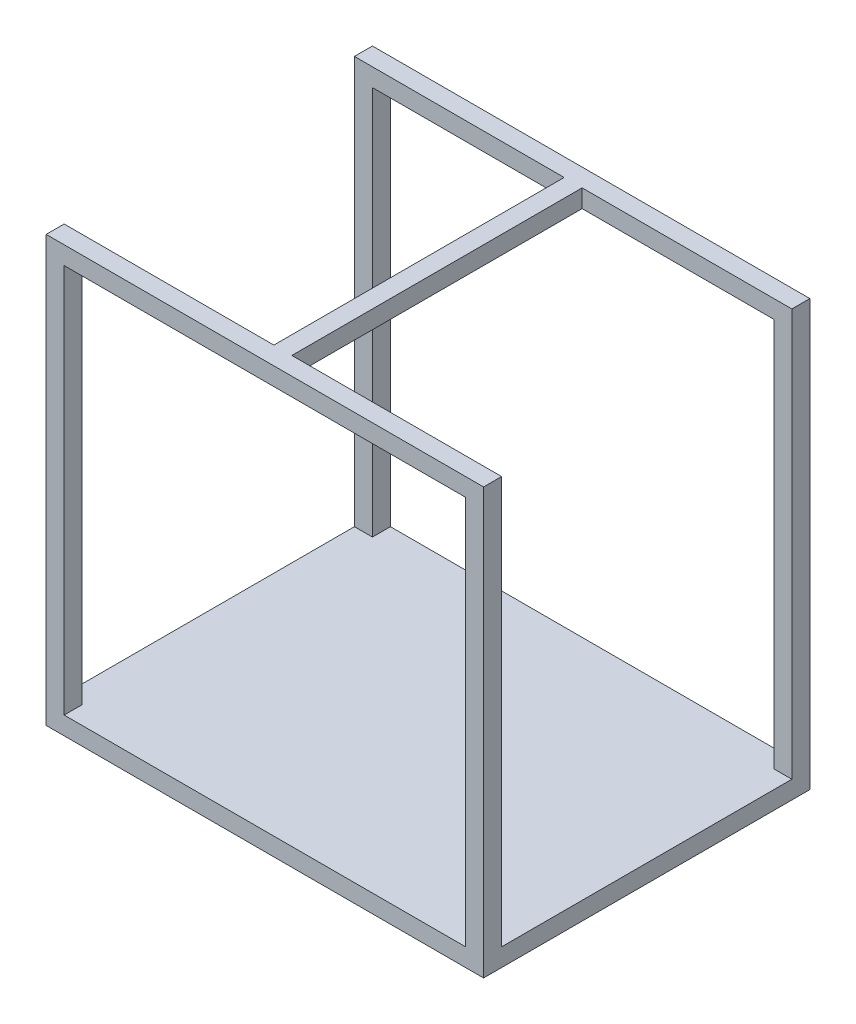
ISO-10303-21;
HEADER;
FILE_DESCRIPTION(('STEP AP214'),'2;1');
FILE_NAME('part.step','',(''),(''),'','','');
FILE_SCHEMA(('AUTOMOTIVE_DESIGN { 1 0 10303 214 1 1 1 1 }'));
ENDSEC;
DATA;
#1=APPLICATION_CONTEXT('core data for automotive mechanical design processes');
#2=APPLICATION_PROTOCOL_DEFINITION('international standard','automotive_design',2000,#1);
#3=PRODUCT_CONTEXT('',#1,'mechanical');
#4=PRODUCT('Part','Part','',(#3));
#5=PRODUCT_RELATED_PRODUCT_CATEGORY('part','',(#4));
#6=PRODUCT_DEFINITION_FORMATION('','',#4);
#7=PRODUCT_DEFINITION_CONTEXT('part definition',#1,'design');
#8=PRODUCT_DEFINITION('design','',#6,#7);
#9=PRODUCT_DEFINITION_SHAPE('','',#8);
#10=(LENGTH_UNIT() NAMED_UNIT(*) SI_UNIT(.MILLI.,.METRE.));
#11=(NAMED_UNIT(*) PLANE_ANGLE_UNIT() SI_UNIT($,.RADIAN.));
#12=(NAMED_UNIT(*) SI_UNIT($,.STERADIAN.) SOLID_ANGLE_UNIT());
#13=UNCERTAINTY_MEASURE_WITH_UNIT(LENGTH_MEASURE(1.E-05),#10,'distance_accuracy_value','');
#14=(GEOMETRIC_REPRESENTATION_CONTEXT(3) GLOBAL_UNCERTAINTY_ASSIGNED_CONTEXT((#13)) GLOBAL_UNIT_ASSIGNED_CONTEXT((#10,
#11,#12)) REPRESENTATION_CONTEXT('',''));
#15=CARTESIAN_POINT('',(0.,0.,0.));
#16=DIRECTION('',(0.,0.,1.));
#17=DIRECTION('',(1.,0.,0.));
#18=AXIS2_PLACEMENT_3D('',#15,#16,#17);
#19=CARTESIAN_POINT('',(-617.22,-270.302017099121,-24.1090659340658));
#20=DIRECTION('',(0.,0.,-1.));
#21=DIRECTION('',(0.,1.,0.));
#22=AXIS2_PLACEMENT_3D('',#19,#20,#21);
#23=PLANE('',#22);
#24=DIRECTION('',(0.,1.,0.));
#25=VECTOR('',#24,1.);
#26=CARTESIAN_POINT('',(0.,-270.302017099121,-24.1090659340658));
#27=LINE('',#26,#25);
#28=CARTESIAN_POINT('',(0.,-270.302017099121,-24.1090659340658));
#29=VERTEX_POINT('',#28);
#30=CARTESIAN_POINT('',(0.,304.372982900879,-24.1090659340659));
#31=VERTEX_POINT('',#30);
#32=EDGE_CURVE('E185',#29,#31,#27,.T.);
#33=ORIENTED_EDGE('',*,*,#32,.T.);
#34=DIRECTION('',(-1.,0.,0.));
#35=VECTOR('',#34,1.);
#36=CARTESIAN_POINT('',(0.,304.372982900879,-24.1090659340659));
#37=LINE('',#36,#35);
#38=CARTESIAN_POINT('',(-295.91,304.372982900879,-24.1090659340658));
#39=VERTEX_POINT('',#38);
#40=EDGE_CURVE('E286',#31,#39,#37,.T.);
#41=ORIENTED_EDGE('',*,*,#40,.T.);
#42=DIRECTION('',(0.,1.,0.));
#43=VECTOR('',#42,1.);
#44=CARTESIAN_POINT('',(-295.91,-295.703017099121,-24.1090659340659));
#45=LINE('',#44,#43);
#46=CARTESIAN_POINT('',(-295.91,278.972982900879,-24.1090659340658));
#47=VERTEX_POINT('',#46);
#48=EDGE_CURVE('E356',#47,#39,#45,.T.);
#49=ORIENTED_EDGE('',*,*,#48,.F.);
#50=DIRECTION('',(1.,0.,0.));
#51=VECTOR('',#50,1.);
#52=CARTESIAN_POINT('',(0.,278.972982900879,-24.1090659340659));
#53=LINE('',#52,#51);
#54=CARTESIAN_POINT('',(-25.4,278.972982900879,-24.1090659340659));
#55=VERTEX_POINT('',#54);
#56=EDGE_CURVE('E359',#47,#55,#53,.T.);
#57=ORIENTED_EDGE('',*,*,#56,.T.);
#58=DIRECTION('',(0.,-1.,0.));
#59=VECTOR('',#58,1.);
#60=CARTESIAN_POINT('',(-25.4,-270.302017099121,-24.1090659340658));
#61=LINE('',#60,#59);
#62=CARTESIAN_POINT('',(-25.4,-270.302017099121,-24.1090659340659));
#63=VERTEX_POINT('',#62);
#64=EDGE_CURVE('E261',#55,#63,#61,.T.);
#65=ORIENTED_EDGE('',*,*,#64,.T.);
#66=DIRECTION('',(1.,0.,0.));
#67=VECTOR('',#66,1.);
#68=CARTESIAN_POINT('',(-617.22,-270.302017099121,-24.1090659340658));
#69=LINE('',#68,#67);
#70=EDGE_CURVE('E244',#63,#29,#69,.T.);
#71=ORIENTED_EDGE('',*,*,#70,.T.);
#72=EDGE_LOOP('',(#33,#41,#49,#57,#65,#71));
#73=FACE_BOUND('',#72,.T.);
#74=ADVANCED_FACE('F33',(#73),#23,.F.);
#75=CARTESIAN_POINT('',(-617.22,278.972982900879,385.465934065934));
#76=DIRECTION('',(0.,0.,1.));
#77=DIRECTION('',(1.,0.,0.));
#78=AXIS2_PLACEMENT_3D('',#75,#76,#77);
#79=PLANE('',#78);
#80=DIRECTION('',(1.,0.,0.));
#81=VECTOR('',#80,1.);
#82=CARTESIAN_POINT('',(-617.22,-270.302017099121,385.465934065934));
#83=LINE('',#82,#81);
#84=CARTESIAN_POINT('',(-25.4,-270.302017099121,385.465934065934));
#85=VERTEX_POINT('',#84);
#86=CARTESIAN_POINT('',(0.,-270.302017099121,385.465934065934));
#87=VERTEX_POINT('',#86);
#88=EDGE_CURVE('E245',#85,#87,#83,.T.);
#89=ORIENTED_EDGE('',*,*,#88,.F.);
#90=DIRECTION('',(0.,1.,0.));
#91=VECTOR('',#90,1.);
#92=CARTESIAN_POINT('',(-25.4,278.972982900879,385.465934065934));
#93=LINE('',#92,#91);
#94=CARTESIAN_POINT('',(-25.4,278.972982900879,385.465934065934));
#95=VERTEX_POINT('',#94);
#96=EDGE_CURVE('E11',#85,#95,#93,.T.);
#97=ORIENTED_EDGE('',*,*,#96,.T.);
#98=DIRECTION('',(1.,0.,0.));
#99=VECTOR('',#98,1.);
#100=CARTESIAN_POINT('',(-617.22,278.972982900879,385.465934065934));
#101=LINE('',#100,#99);
#102=CARTESIAN_POINT('',(-295.91,278.972982900879,385.465934065934));
#103=VERTEX_POINT('',#102);
#104=EDGE_CURVE('E347',#103,#95,#101,.T.);
#105=ORIENTED_EDGE('',*,*,#104,.F.);
#106=DIRECTION('',(0.,1.,0.));
#107=VECTOR('',#106,1.);
#108=CARTESIAN_POINT('',(-295.91,-295.703017099121,385.465934065934));
#109=LINE('',#108,#107);
#110=CARTESIAN_POINT('',(-295.91,304.372982900879,385.465934065934));
#111=VERTEX_POINT('',#110);
#112=EDGE_CURVE('E357',#103,#111,#109,.T.);
#113=ORIENTED_EDGE('',*,*,#112,.T.);
#114=DIRECTION('',(1.,0.,0.));
#115=VECTOR('',#114,1.);
#116=CARTESIAN_POINT('',(-295.91,304.372982900879,385.465934065934));
#117=LINE('',#116,#115);
#118=CARTESIAN_POINT('',(0.,304.372982900879,385.465934065934));
#119=VERTEX_POINT('',#118);
#120=EDGE_CURVE('E354',#111,#119,#117,.T.);
#121=ORIENTED_EDGE('',*,*,#120,.T.);
#122=DIRECTION('',(0.,-1.,0.));
#123=VECTOR('',#122,1.);
#124=CARTESIAN_POINT('',(0.,278.972982900879,385.465934065934));
#125=LINE('',#124,#123);
#126=EDGE_CURVE('E258',#119,#87,#125,.T.);
#127=ORIENTED_EDGE('',*,*,#126,.T.);
#128=EDGE_LOOP('',(#89,#97,#105,#113,#121,#127));
#129=FACE_BOUND('',#128,.T.);
#130=ADVANCED_FACE('F378',(#129),#79,.F.);
#131=CARTESIAN_POINT('',(-617.22,304.372982900879,-49.5090659340659));
#132=DIRECTION('',(0.,1.,0.));
#133=DIRECTION('',(0.,0.,1.));
#134=AXIS2_PLACEMENT_3D('',#131,#132,#133);
#135=PLANE('',#134);
#136=DIRECTION('',(-1.,0.,0.));
#137=VECTOR('',#136,1.);
#138=CARTESIAN_POINT('',(-617.22,304.372982900879,-24.1090659340659));
#139=LINE('',#138,#137);
#140=CARTESIAN_POINT('',(-321.31,304.372982900879,-24.1090659340658));
#141=VERTEX_POINT('',#140);
#142=CARTESIAN_POINT('',(-617.22,304.372982900879,-24.1090659340659));
#143=VERTEX_POINT('',#142);
#144=EDGE_CURVE('E338',#141,#143,#139,.T.);
#145=ORIENTED_EDGE('',*,*,#144,.F.);
#146=DIRECTION('',(0.,0.,-1.));
#147=VECTOR('',#146,1.);
#148=CARTESIAN_POINT('',(-321.31,304.372982900879,-24.1090659340658));
#149=LINE('',#148,#147);
#150=CARTESIAN_POINT('',(-321.31,304.372982900879,385.465934065934));
#151=VERTEX_POINT('',#150);
#152=EDGE_CURVE('E193',#151,#141,#149,.T.);
#153=ORIENTED_EDGE('',*,*,#152,.F.);
#154=DIRECTION('',(1.,0.,0.));
#155=VECTOR('',#154,1.);
#156=CARTESIAN_POINT('',(-321.31,304.372982900879,385.465934065934));
#157=LINE('',#156,#155);
#158=CARTESIAN_POINT('',(-617.22,304.372982900879,385.465934065934));
#159=VERTEX_POINT('',#158);
#160=EDGE_CURVE('E176',#159,#151,#157,.T.);
#161=ORIENTED_EDGE('',*,*,#160,.F.);
#162=DIRECTION('',(0.,0.,1.));
#163=VECTOR('',#162,1.);
#164=CARTESIAN_POINT('',(-617.22,304.372982900879,-49.5090659340659));
#165=LINE('',#164,#163);
#166=CARTESIAN_POINT('',(-617.22,304.372982900879,410.865934065934));
#167=VERTEX_POINT('',#166);
#168=EDGE_CURVE('E190',#159,#167,#165,.T.);
#169=ORIENTED_EDGE('',*,*,#168,.T.);
#170=DIRECTION('',(1.,0.,0.));
#171=VECTOR('',#170,1.);
#172=CARTESIAN_POINT('',(-617.22,304.372982900879,410.865934065934));
#173=LINE('',#172,#171);
#174=CARTESIAN_POINT('',(0.,304.372982900879,410.865934065934));
#175=VERTEX_POINT('',#174);
#176=EDGE_CURVE('E218',#167,#175,#173,.T.);
#177=ORIENTED_EDGE('',*,*,#176,.T.);
#178=DIRECTION('',(0.,0.,1.));
#179=VECTOR('',#178,1.);
#180=CARTESIAN_POINT('',(0.,304.372982900879,-49.5090659340659));
#181=LINE('',#180,#179);
#182=EDGE_CURVE('E223',#119,#175,#181,.T.);
#183=ORIENTED_EDGE('',*,*,#182,.F.);
#184=ORIENTED_EDGE('',*,*,#120,.F.);
#185=DIRECTION('',(0.,0.,1.));
#186=VECTOR('',#185,1.);
#187=CARTESIAN_POINT('',(-295.91,304.372982900879,-24.1090659340658));
#188=LINE('',#187,#186);
#189=EDGE_CURVE('E351',#39,#111,#188,.T.);
#190=ORIENTED_EDGE('',*,*,#189,.F.);
#191=ORIENTED_EDGE('',*,*,#40,.F.);
#192=CARTESIAN_POINT('',(0.,304.372982900879,-49.5090659340659));
#193=VERTEX_POINT('',#192);
#194=EDGE_CURVE('E219',#193,#31,#181,.T.);
#195=ORIENTED_EDGE('',*,*,#194,.F.);
#196=DIRECTION('',(1.,0.,0.));
#197=VECTOR('',#196,1.);
#198=CARTESIAN_POINT('',(-617.22,304.372982900879,-49.5090659340659));
#199=LINE('',#198,#197);
#200=CARTESIAN_POINT('',(-617.22,304.372982900879,-49.5090659340659));
#201=VERTEX_POINT('',#200);
#202=EDGE_CURVE('E228',#201,#193,#199,.T.);
#203=ORIENTED_EDGE('',*,*,#202,.F.);
#204=EDGE_CURVE('E201',#201,#143,#165,.T.);
#205=ORIENTED_EDGE('',*,*,#204,.T.);
#206=EDGE_LOOP('',(#145,#153,#161,#169,#177,#183,#184,#190,#191,#195,#203,#205));
#207=FACE_BOUND('',#206,.T.);
#208=ADVANCED_FACE('F35',(#207),#135,.T.);
#209=CARTESIAN_POINT('',(-617.22,-295.702017099121,-49.5090659340658));
#210=DIRECTION('',(0.,0.,-1.));
#211=DIRECTION('',(0.,1.,0.));
#212=AXIS2_PLACEMENT_3D('',#209,#210,#211);
#213=PLANE('',#212);
#214=DIRECTION('',(-1.,0.,0.));
#215=VECTOR('',#214,1.);
#216=CARTESIAN_POINT('',(-25.4,278.972982900879,-49.5090659340658));
#217=LINE('',#216,#215);
#218=CARTESIAN_POINT('',(-25.4,278.972982900879,-49.5090659340658));
#219=VERTEX_POINT('',#218);
#220=CARTESIAN_POINT('',(-591.82,278.972982900879,-49.5090659340658));
#221=VERTEX_POINT('',#220);
#222=EDGE_CURVE('E312',#219,#221,#217,.T.);
#223=ORIENTED_EDGE('',*,*,#222,.T.);
#224=DIRECTION('',(0.,-1.,0.));
#225=VECTOR('',#224,1.);
#226=CARTESIAN_POINT('',(-591.82,278.972982900879,-49.5090659340658));
#227=LINE('',#226,#225);
#228=CARTESIAN_POINT('',(-591.82,-270.302017099121,-49.5090659340658));
#229=VERTEX_POINT('',#228);
#230=EDGE_CURVE('E310',#221,#229,#227,.T.);
#231=ORIENTED_EDGE('',*,*,#230,.T.);
#232=DIRECTION('',(1.,0.,0.));
#233=VECTOR('',#232,1.);
#234=CARTESIAN_POINT('',(-591.82,-270.302017099121,-49.5090659340658));
#235=LINE('',#234,#233);
#236=CARTESIAN_POINT('',(-25.4,-270.302017099121,-49.5090659340658));
#237=VERTEX_POINT('',#236);
#238=EDGE_CURVE('E56',#229,#237,#235,.T.);
#239=ORIENTED_EDGE('',*,*,#238,.T.);
#240=DIRECTION('',(0.,1.,0.));
#241=VECTOR('',#240,1.);
#242=CARTESIAN_POINT('',(-25.4,-270.302017099121,-49.5090659340658));
#243=LINE('',#242,#241);
#244=EDGE_CURVE('E299',#237,#219,#243,.T.);
#245=ORIENTED_EDGE('',*,*,#244,.T.);
#246=EDGE_LOOP('',(#223,#231,#239,#245));
#247=FACE_BOUND('',#246,.T.);
#248=DIRECTION('',(0.,1.,0.));
#249=VECTOR('',#248,1.);
#250=CARTESIAN_POINT('',(0.,-295.702017099121,-49.5090659340658));
#251=LINE('',#250,#249);
#252=CARTESIAN_POINT('',(0.,-295.702017099121,-49.5090659340658));
#253=VERTEX_POINT('',#252);
#254=EDGE_CURVE('E202',#253,#193,#251,.T.);
#255=ORIENTED_EDGE('',*,*,#254,.F.);
#256=DIRECTION('',(1.,0.,0.));
#257=VECTOR('',#256,1.);
#258=CARTESIAN_POINT('',(-617.22,-295.702017099121,-49.5090659340658));
#259=LINE('',#258,#257);
#260=CARTESIAN_POINT('',(-617.22,-295.702017099121,-49.5090659340658));
#261=VERTEX_POINT('',#260);
#262=EDGE_CURVE('E230',#261,#253,#259,.T.);
#263=ORIENTED_EDGE('',*,*,#262,.F.);
#264=DIRECTION('',(0.,1.,0.));
#265=VECTOR('',#264,1.);
#266=CARTESIAN_POINT('',(-617.22,-295.702017099121,-49.5090659340658));
#267=LINE('',#266,#265);
#268=EDGE_CURVE('E215',#261,#201,#267,.T.);
#269=ORIENTED_EDGE('',*,*,#268,.T.);
#270=ORIENTED_EDGE('',*,*,#202,.T.);
#271=EDGE_LOOP('',(#255,#263,#269,#270));
#272=FACE_BOUND('',#271,.T.);
#273=ADVANCED_FACE('F280',(#247,#272),#213,.T.);
#274=CARTESIAN_POINT('',(-617.22,-295.702017099121,410.865934065934));
#275=DIRECTION('',(0.,-1.,0.));
#276=DIRECTION('',(0.,0.,-1.));
#277=AXIS2_PLACEMENT_3D('',#274,#275,#276);
#278=PLANE('',#277);
#279=DIRECTION('',(0.,0.,-1.));
#280=VECTOR('',#279,1.);
#281=CARTESIAN_POINT('',(0.,-295.702017099121,410.865934065934));
#282=LINE('',#281,#280);
#283=CARTESIAN_POINT('',(0.,-295.702017099121,410.865934065934));
#284=VERTEX_POINT('',#283);
#285=EDGE_CURVE('E206',#284,#253,#282,.T.);
#286=ORIENTED_EDGE('',*,*,#285,.F.);
#287=DIRECTION('',(1.,0.,0.));
#288=VECTOR('',#287,1.);
#289=CARTESIAN_POINT('',(-617.22,-295.702017099121,410.865934065934));
#290=LINE('',#289,#288);
#291=CARTESIAN_POINT('',(-617.22,-295.702017099121,410.865934065934));
#292=VERTEX_POINT('',#291);
#293=EDGE_CURVE('E232',#292,#284,#290,.T.);
#294=ORIENTED_EDGE('',*,*,#293,.F.);
#295=DIRECTION('',(0.,0.,-1.));
#296=VECTOR('',#295,1.);
#297=CARTESIAN_POINT('',(-617.22,-295.702017099121,410.865934065934));
#298=LINE('',#297,#296);
#299=EDGE_CURVE('E212',#292,#261,#298,.T.);
#300=ORIENTED_EDGE('',*,*,#299,.T.);
#301=ORIENTED_EDGE('',*,*,#262,.T.);
#302=EDGE_LOOP('',(#286,#294,#300,#301));
#303=FACE_BOUND('',#302,.T.);
#304=ADVANCED_FACE('F277',(#303),#278,.T.);
#305=CARTESIAN_POINT('',(-617.22,304.372982900879,410.865934065934));
#306=DIRECTION('',(0.,0.,1.));
#307=DIRECTION('',(0.,-1.,0.));
#308=AXIS2_PLACEMENT_3D('',#305,#306,#307);
#309=PLANE('',#308);
#310=DIRECTION('',(-1.,0.,0.));
#311=VECTOR('',#310,1.);
#312=CARTESIAN_POINT('',(-25.4,278.972982900879,410.865934065934));
#313=LINE('',#312,#311);
#314=CARTESIAN_POINT('',(-25.4,278.972982900879,410.865934065934));
#315=VERTEX_POINT('',#314);
#316=CARTESIAN_POINT('',(-591.82,278.972982900879,410.865934065934));
#317=VERTEX_POINT('',#316);
#318=EDGE_CURVE('E316',#315,#317,#313,.T.);
#319=ORIENTED_EDGE('',*,*,#318,.F.);
#320=DIRECTION('',(0.,1.,0.));
#321=VECTOR('',#320,1.);
#322=CARTESIAN_POINT('',(-25.4,-270.302017099121,410.865934065934));
#323=LINE('',#322,#321);
#324=CARTESIAN_POINT('',(-25.4,-270.302017099121,410.865934065934));
#325=VERTEX_POINT('',#324);
#326=EDGE_CURVE('E322',#325,#315,#323,.T.);
#327=ORIENTED_EDGE('',*,*,#326,.F.);
#328=DIRECTION('',(1.,0.,0.));
#329=VECTOR('',#328,1.);
#330=CARTESIAN_POINT('',(-591.82,-270.302017099121,410.865934065934));
#331=LINE('',#330,#329);
#332=CARTESIAN_POINT('',(-591.82,-270.302017099121,410.865934065934));
#333=VERTEX_POINT('',#332);
#334=EDGE_CURVE('E320',#333,#325,#331,.T.);
#335=ORIENTED_EDGE('',*,*,#334,.F.);
#336=DIRECTION('',(0.,-1.,0.));
#337=VECTOR('',#336,1.);
#338=CARTESIAN_POINT('',(-591.82,278.972982900879,410.865934065934));
#339=LINE('',#338,#337);
#340=EDGE_CURVE('E318',#317,#333,#339,.T.);
#341=ORIENTED_EDGE('',*,*,#340,.F.);
#342=EDGE_LOOP('',(#319,#327,#335,#341));
#343=FACE_BOUND('',#342,.T.);
#344=DIRECTION('',(0.,-1.,0.));
#345=VECTOR('',#344,1.);
#346=CARTESIAN_POINT('',(0.,304.372982900879,410.865934065934));
#347=LINE('',#346,#345);
#348=EDGE_CURVE('E222',#175,#284,#347,.T.);
#349=ORIENTED_EDGE('',*,*,#348,.F.);
#350=ORIENTED_EDGE('',*,*,#176,.F.);
#351=DIRECTION('',(0.,-1.,0.));
#352=VECTOR('',#351,1.);
#353=CARTESIAN_POINT('',(-617.22,304.372982900879,410.865934065934));
#354=LINE('',#353,#352);
#355=EDGE_CURVE('E200',#167,#292,#354,.T.);
#356=ORIENTED_EDGE('',*,*,#355,.T.);
#357=ORIENTED_EDGE('',*,*,#293,.T.);
#358=EDGE_LOOP('',(#349,#350,#356,#357));
#359=FACE_BOUND('',#358,.T.);
#360=ADVANCED_FACE('F274',(#343,#359),#309,.T.);
#361=CARTESIAN_POINT('',(-617.22,0.,0.));
#362=DIRECTION('',(1.,0.,0.));
#363=DIRECTION('',(0.,0.,-1.));
#364=AXIS2_PLACEMENT_3D('',#361,#362,#363);
#365=PLANE('',#364);
#366=DIRECTION('',(0.,1.,0.));
#367=VECTOR('',#366,1.);
#368=CARTESIAN_POINT('',(-617.22,-270.302017099121,-24.1090659340658));
#369=LINE('',#368,#367);
#370=CARTESIAN_POINT('',(-617.22,-270.302017099121,-24.1090659340658));
#371=VERTEX_POINT('',#370);
#372=EDGE_CURVE('E247',#371,#143,#369,.T.);
#373=ORIENTED_EDGE('',*,*,#372,.T.);
#374=ORIENTED_EDGE('',*,*,#204,.F.);
#375=ORIENTED_EDGE('',*,*,#268,.F.);
#376=ORIENTED_EDGE('',*,*,#299,.F.);
#377=ORIENTED_EDGE('',*,*,#355,.F.);
#378=ORIENTED_EDGE('',*,*,#168,.F.);
#379=DIRECTION('',(0.,-1.,0.));
#380=VECTOR('',#379,1.);
#381=CARTESIAN_POINT('',(-617.22,278.972982900879,385.465934065934));
#382=LINE('',#381,#380);
#383=CARTESIAN_POINT('',(-617.22,-270.302017099121,385.465934065934));
#384=VERTEX_POINT('',#383);
#385=EDGE_CURVE('E173',#159,#384,#382,.T.);
#386=ORIENTED_EDGE('',*,*,#385,.T.);
#387=DIRECTION('',(0.,0.,-1.));
#388=VECTOR('',#387,1.);
#389=CARTESIAN_POINT('',(-617.22,-270.302017099121,385.465934065934));
#390=LINE('',#389,#388);
#391=EDGE_CURVE('E184',#384,#371,#390,.T.);
#392=ORIENTED_EDGE('',*,*,#391,.T.);
#393=EDGE_LOOP('',(#373,#374,#375,#376,#377,#378,#386,#392));
#394=FACE_BOUND('',#393,.T.);
#395=ADVANCED_FACE('F197',(#394),#365,.F.);
#396=CARTESIAN_POINT('',(0.,0.,0.));
#397=DIRECTION('',(1.,0.,0.));
#398=DIRECTION('',(0.,0.,-1.));
#399=AXIS2_PLACEMENT_3D('',#396,#397,#398);
#400=PLANE('',#399);
#401=ORIENTED_EDGE('',*,*,#126,.F.);
#402=ORIENTED_EDGE('',*,*,#182,.T.);
#403=ORIENTED_EDGE('',*,*,#348,.T.);
#404=ORIENTED_EDGE('',*,*,#285,.T.);
#405=ORIENTED_EDGE('',*,*,#254,.T.);
#406=ORIENTED_EDGE('',*,*,#194,.T.);
#407=ORIENTED_EDGE('',*,*,#32,.F.);
#408=DIRECTION('',(0.,0.,-1.));
#409=VECTOR('',#408,1.);
#410=CARTESIAN_POINT('',(0.,-270.302017099121,385.465934065934));
#411=LINE('',#410,#409);
#412=EDGE_CURVE('E260',#87,#29,#411,.T.);
#413=ORIENTED_EDGE('',*,*,#412,.F.);
#414=EDGE_LOOP('',(#401,#402,#403,#404,#405,#406,#407,#413));
#415=FACE_BOUND('',#414,.T.);
#416=ADVANCED_FACE('F268',(#415),#400,.T.);
#417=CARTESIAN_POINT('',(-617.22,278.972982900879,-24.1090659340658));
#418=DIRECTION('',(0.,1.,0.));
#419=DIRECTION('',(0.,0.,1.));
#420=AXIS2_PLACEMENT_3D('',#417,#418,#419);
#421=PLANE('',#420);
#422=DIRECTION('',(0.,0.,1.));
#423=VECTOR('',#422,1.);
#424=CARTESIAN_POINT('',(-321.31,278.972982900879,-24.1090659340658));
#425=LINE('',#424,#423);
#426=CARTESIAN_POINT('',(-321.31,278.972982900879,-24.1090659340658));
#427=VERTEX_POINT('',#426);
#428=CARTESIAN_POINT('',(-321.31,278.972982900879,385.465934065934));
#429=VERTEX_POINT('',#428);
#430=EDGE_CURVE('E194',#427,#429,#425,.T.);
#431=ORIENTED_EDGE('',*,*,#430,.F.);
#432=DIRECTION('',(1.,0.,0.));
#433=VECTOR('',#432,1.);
#434=CARTESIAN_POINT('',(-617.22,278.972982900879,-24.1090659340658));
#435=LINE('',#434,#433);
#436=CARTESIAN_POINT('',(-591.82,278.972982900879,-24.1090659340658));
#437=VERTEX_POINT('',#436);
#438=EDGE_CURVE('E334',#437,#427,#435,.T.);
#439=ORIENTED_EDGE('',*,*,#438,.F.);
#440=DIRECTION('',(0.,0.,1.));
#441=VECTOR('',#440,1.);
#442=CARTESIAN_POINT('',(-591.82,278.972982900879,-49.5090659340658));
#443=LINE('',#442,#441);
#444=EDGE_CURVE('E329',#221,#437,#443,.T.);
#445=ORIENTED_EDGE('',*,*,#444,.F.);
#446=ORIENTED_EDGE('',*,*,#222,.F.);
#447=DIRECTION('',(0.,0.,1.));
#448=VECTOR('',#447,1.);
#449=CARTESIAN_POINT('',(-25.4,278.972982900879,-49.5090659340658));
#450=LINE('',#449,#448);
#451=EDGE_CURVE('E302',#219,#55,#450,.T.);
#452=ORIENTED_EDGE('',*,*,#451,.T.);
#453=ORIENTED_EDGE('',*,*,#56,.F.);
#454=DIRECTION('',(0.,0.,-1.));
#455=VECTOR('',#454,1.);
#456=CARTESIAN_POINT('',(-295.91,278.972982900879,-24.1090659340658));
#457=LINE('',#456,#455);
#458=EDGE_CURVE('E48',#103,#47,#457,.T.);
#459=ORIENTED_EDGE('',*,*,#458,.F.);
#460=ORIENTED_EDGE('',*,*,#104,.T.);
#461=EDGE_CURVE('E295',#95,#315,#450,.T.);
#462=ORIENTED_EDGE('',*,*,#461,.T.);
#463=ORIENTED_EDGE('',*,*,#318,.T.);
#464=CARTESIAN_POINT('',(-591.82,278.972982900879,385.465934065934));
#465=VERTEX_POINT('',#464);
#466=EDGE_CURVE('E306',#465,#317,#443,.T.);
#467=ORIENTED_EDGE('',*,*,#466,.F.);
#468=DIRECTION('',(-1.,0.,0.));
#469=VECTOR('',#468,1.);
#470=CARTESIAN_POINT('',(-321.31,278.972982900879,385.465934065934));
#471=LINE('',#470,#469);
#472=EDGE_CURVE('E236',#429,#465,#471,.T.);
#473=ORIENTED_EDGE('',*,*,#472,.F.);
#474=EDGE_LOOP('',(#431,#439,#445,#446,#452,#453,#459,#460,#462,#463,#467,#473));
#475=FACE_BOUND('',#474,.T.);
#476=ADVANCED_FACE('F363',(#475),#421,.F.);
#477=CARTESIAN_POINT('',(-591.82,-270.302017099121,-24.1090659340659));
#478=VERTEX_POINT('',#477);
#479=EDGE_CURVE('E246',#371,#478,#69,.T.);
#480=ORIENTED_EDGE('',*,*,#479,.T.);
#481=DIRECTION('',(0.,1.,0.));
#482=VECTOR('',#481,1.);
#483=CARTESIAN_POINT('',(-591.82,-270.302017099121,-24.1090659340658));
#484=LINE('',#483,#482);
#485=EDGE_CURVE('E325',#478,#437,#484,.T.);
#486=ORIENTED_EDGE('',*,*,#485,.T.);
#487=ORIENTED_EDGE('',*,*,#438,.T.);
#488=DIRECTION('',(0.,1.,0.));
#489=VECTOR('',#488,1.);
#490=CARTESIAN_POINT('',(-321.31,-295.703017099121,-24.1090659340659));
#491=LINE('',#490,#489);
#492=EDGE_CURVE('E339',#427,#141,#491,.T.);
#493=ORIENTED_EDGE('',*,*,#492,.T.);
#494=ORIENTED_EDGE('',*,*,#144,.T.);
#495=ORIENTED_EDGE('',*,*,#372,.F.);
#496=EDGE_LOOP('',(#480,#486,#487,#493,#494,#495));
#497=FACE_BOUND('',#496,.T.);
#498=ADVANCED_FACE('F333',(#497),#23,.F.);
#499=CARTESIAN_POINT('',(-617.22,-270.302017099121,385.465934065934));
#500=DIRECTION('',(0.,-1.,0.));
#501=DIRECTION('',(0.,0.,-1.));
#502=AXIS2_PLACEMENT_3D('',#499,#500,#501);
#503=PLANE('',#502);
#504=CARTESIAN_POINT('',(-591.82,-270.302017099121,385.465934065934));
#505=VERTEX_POINT('',#504);
#506=EDGE_CURVE('E180',#384,#505,#83,.T.);
#507=ORIENTED_EDGE('',*,*,#506,.T.);
#508=DIRECTION('',(0.,0.,1.));
#509=VECTOR('',#508,1.);
#510=CARTESIAN_POINT('',(-591.82,-270.302017099121,-49.5090659340658));
#511=LINE('',#510,#509);
#512=EDGE_CURVE('E242',#505,#333,#511,.T.);
#513=ORIENTED_EDGE('',*,*,#512,.T.);
#514=ORIENTED_EDGE('',*,*,#334,.T.);
#515=DIRECTION('',(0.,0.,1.));
#516=VECTOR('',#515,1.);
#517=CARTESIAN_POINT('',(-25.4,-270.302017099121,-49.5090659340658));
#518=LINE('',#517,#516);
#519=EDGE_CURVE('E296',#85,#325,#518,.T.);
#520=ORIENTED_EDGE('',*,*,#519,.F.);
#521=ORIENTED_EDGE('',*,*,#88,.T.);
#522=ORIENTED_EDGE('',*,*,#412,.T.);
#523=ORIENTED_EDGE('',*,*,#70,.F.);
#524=EDGE_CURVE('E292',#237,#63,#518,.T.);
#525=ORIENTED_EDGE('',*,*,#524,.F.);
#526=ORIENTED_EDGE('',*,*,#238,.F.);
#527=EDGE_CURVE('E327',#229,#478,#511,.T.);
#528=ORIENTED_EDGE('',*,*,#527,.T.);
#529=ORIENTED_EDGE('',*,*,#479,.F.);
#530=ORIENTED_EDGE('',*,*,#391,.F.);
#531=EDGE_LOOP('',(#507,#513,#514,#520,#521,#522,#523,#525,#526,#528,#529,#530));
#532=FACE_BOUND('',#531,.T.);
#533=ADVANCED_FACE('F240',(#532),#503,.F.);
#534=ORIENTED_EDGE('',*,*,#385,.F.);
#535=ORIENTED_EDGE('',*,*,#160,.T.);
#536=DIRECTION('',(0.,1.,0.));
#537=VECTOR('',#536,1.);
#538=CARTESIAN_POINT('',(-321.31,-295.703017099121,385.465934065934));
#539=LINE('',#538,#537);
#540=EDGE_CURVE('E340',#429,#151,#539,.T.);
#541=ORIENTED_EDGE('',*,*,#540,.F.);
#542=ORIENTED_EDGE('',*,*,#472,.T.);
#543=DIRECTION('',(0.,-1.,0.));
#544=VECTOR('',#543,1.);
#545=CARTESIAN_POINT('',(-591.82,278.972982900879,385.465934065934));
#546=LINE('',#545,#544);
#547=EDGE_CURVE('E41',#465,#505,#546,.T.);
#548=ORIENTED_EDGE('',*,*,#547,.T.);
#549=ORIENTED_EDGE('',*,*,#506,.F.);
#550=EDGE_LOOP('',(#534,#535,#541,#542,#548,#549));
#551=FACE_BOUND('',#550,.T.);
#552=ADVANCED_FACE('F175',(#551),#79,.F.);
#553=CARTESIAN_POINT('',(-591.82,278.972982900879,-49.5090659340658));
#554=DIRECTION('',(-1.,0.,0.));
#555=DIRECTION('',(0.,-1.,0.));
#556=AXIS2_PLACEMENT_3D('',#553,#554,#555);
#557=PLANE('',#556);
#558=ORIENTED_EDGE('',*,*,#466,.T.);
#559=ORIENTED_EDGE('',*,*,#340,.T.);
#560=ORIENTED_EDGE('',*,*,#512,.F.);
#561=ORIENTED_EDGE('',*,*,#547,.F.);
#562=EDGE_LOOP('',(#558,#559,#560,#561));
#563=FACE_BOUND('',#562,.T.);
#564=ADVANCED_FACE('F372',(#563),#557,.F.);
#565=CARTESIAN_POINT('',(-25.4,-270.302017099121,-49.5090659340658));
#566=DIRECTION('',(1.,0.,0.));
#567=DIRECTION('',(0.,1.,0.));
#568=AXIS2_PLACEMENT_3D('',#565,#566,#567);
#569=PLANE('',#568);
#570=ORIENTED_EDGE('',*,*,#519,.T.);
#571=ORIENTED_EDGE('',*,*,#326,.T.);
#572=ORIENTED_EDGE('',*,*,#461,.F.);
#573=ORIENTED_EDGE('',*,*,#96,.F.);
#574=EDGE_LOOP('',(#570,#571,#572,#573));
#575=FACE_BOUND('',#574,.T.);
#576=ADVANCED_FACE('F381',(#575),#569,.F.);
#577=ORIENTED_EDGE('',*,*,#451,.F.);
#578=ORIENTED_EDGE('',*,*,#244,.F.);
#579=ORIENTED_EDGE('',*,*,#524,.T.);
#580=ORIENTED_EDGE('',*,*,#64,.F.);
#581=EDGE_LOOP('',(#577,#578,#579,#580));
#582=FACE_BOUND('',#581,.T.);
#583=ADVANCED_FACE('F300',(#582),#569,.F.);
#584=ORIENTED_EDGE('',*,*,#527,.F.);
#585=ORIENTED_EDGE('',*,*,#230,.F.);
#586=ORIENTED_EDGE('',*,*,#444,.T.);
#587=ORIENTED_EDGE('',*,*,#485,.F.);
#588=EDGE_LOOP('',(#584,#585,#586,#587));
#589=FACE_BOUND('',#588,.T.);
#590=ADVANCED_FACE('F337',(#589),#557,.F.);
#591=CARTESIAN_POINT('',(-321.31,-295.703017099121,-24.1090659340659));
#592=DIRECTION('',(1.,0.,0.));
#593=DIRECTION('',(0.,0.,-1.));
#594=AXIS2_PLACEMENT_3D('',#591,#592,#593);
#595=PLANE('',#594);
#596=ORIENTED_EDGE('',*,*,#430,.T.);
#597=ORIENTED_EDGE('',*,*,#540,.T.);
#598=ORIENTED_EDGE('',*,*,#152,.T.);
#599=ORIENTED_EDGE('',*,*,#492,.F.);
#600=EDGE_LOOP('',(#596,#597,#598,#599));
#601=FACE_BOUND('',#600,.T.);
#602=ADVANCED_FACE('F369',(#601),#595,.F.);
#603=CARTESIAN_POINT('',(-295.91,-295.703017099121,-24.1090659340659));
#604=DIRECTION('',(-1.,0.,0.));
#605=DIRECTION('',(0.,0.,1.));
#606=AXIS2_PLACEMENT_3D('',#603,#604,#605);
#607=PLANE('',#606);
#608=ORIENTED_EDGE('',*,*,#458,.T.);
#609=ORIENTED_EDGE('',*,*,#48,.T.);
#610=ORIENTED_EDGE('',*,*,#189,.T.);
#611=ORIENTED_EDGE('',*,*,#112,.F.);
#612=EDGE_LOOP('',(#608,#609,#610,#611));
#613=FACE_BOUND('',#612,.T.);
#614=ADVANCED_FACE('F379',(#613),#607,.F.);
#615=CLOSED_SHELL('',(#74,#130,#208,#273,#304,#360,#395,#416,#476,#498,#533,#552,#564,#576,#583,
#590,#602,#614));
#616=MANIFOLD_SOLID_BREP('B2',#615);
#617=ADVANCED_BREP_SHAPE_REPRESENTATION('',(#18,#616),#14);
#618=SHAPE_DEFINITION_REPRESENTATION(#9,#617);
ENDSEC;
END-ISO-10303-21;
